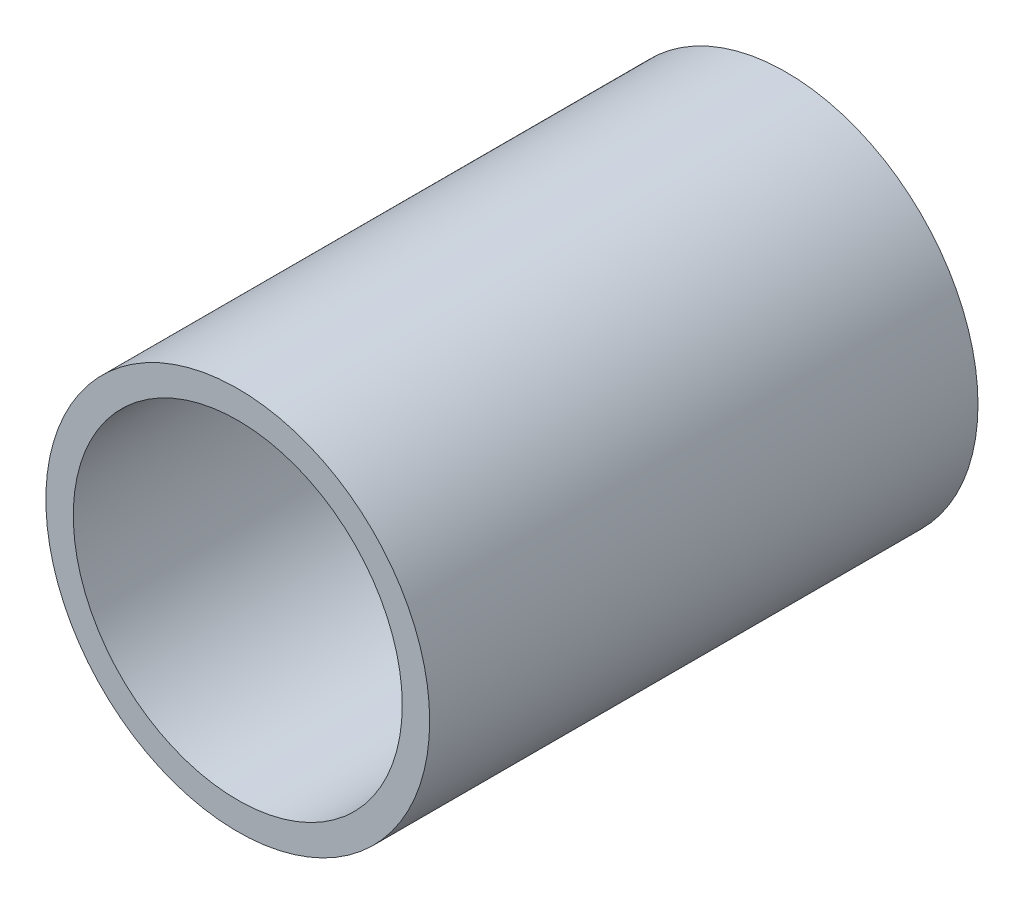
ISO-10303-21;
HEADER;
FILE_DESCRIPTION(('STEP AP214'),'2;1');
FILE_NAME('part.step','',(''),(''),'','','');
FILE_SCHEMA(('AUTOMOTIVE_DESIGN { 1 0 10303 214 1 1 1 1 }'));
ENDSEC;
DATA;
#1=APPLICATION_CONTEXT('core data for automotive mechanical design processes');
#2=APPLICATION_PROTOCOL_DEFINITION('international standard','automotive_design',2000,#1);
#3=PRODUCT_CONTEXT('',#1,'mechanical');
#4=PRODUCT('Part','Part','',(#3));
#5=PRODUCT_RELATED_PRODUCT_CATEGORY('part','',(#4));
#6=PRODUCT_DEFINITION_FORMATION('','',#4);
#7=PRODUCT_DEFINITION_CONTEXT('part definition',#1,'design');
#8=PRODUCT_DEFINITION('design','',#6,#7);
#9=PRODUCT_DEFINITION_SHAPE('','',#8);
#10=(LENGTH_UNIT() NAMED_UNIT(*) SI_UNIT(.MILLI.,.METRE.));
#11=(NAMED_UNIT(*) PLANE_ANGLE_UNIT() SI_UNIT($,.RADIAN.));
#12=(NAMED_UNIT(*) SI_UNIT($,.STERADIAN.) SOLID_ANGLE_UNIT());
#13=UNCERTAINTY_MEASURE_WITH_UNIT(LENGTH_MEASURE(1.E-05),#10,'distance_accuracy_value','');
#14=(GEOMETRIC_REPRESENTATION_CONTEXT(3) GLOBAL_UNCERTAINTY_ASSIGNED_CONTEXT((#13)) GLOBAL_UNIT_ASSIGNED_CONTEXT((#10,
#11,#12)) REPRESENTATION_CONTEXT('',''));
#15=CARTESIAN_POINT('',(0.,0.,0.));
#16=DIRECTION('',(0.,0.,1.));
#17=DIRECTION('',(1.,0.,0.));
#18=AXIS2_PLACEMENT_3D('',#15,#16,#17);
#19=CARTESIAN_POINT('',(0.,0.,25.4));
#20=DIRECTION('',(0.,0.,1.));
#21=DIRECTION('',(1.,0.,0.));
#22=AXIS2_PLACEMENT_3D('',#19,#20,#21);
#23=PLANE('',#22);
#24=CARTESIAN_POINT('',(0.,0.,25.4));
#25=DIRECTION('',(0.,0.,1.));
#26=DIRECTION('',(1.,0.,0.));
#27=AXIS2_PLACEMENT_3D('',#24,#25,#26);
#28=CIRCLE('',#27,8.89);
#29=CARTESIAN_POINT('',(8.89,0.,25.4));
#30=VERTEX_POINT('',#29);
#31=EDGE_CURVE('E10',#30,#30,#28,.T.);
#32=ORIENTED_EDGE('',*,*,#31,.T.);
#33=EDGE_LOOP('',(#32));
#34=FACE_BOUND('',#33,.T.);
#35=CARTESIAN_POINT('',(0.,0.,25.4));
#36=DIRECTION('',(0.,0.,1.));
#37=DIRECTION('',(1.,0.,0.));
#38=AXIS2_PLACEMENT_3D('',#35,#36,#37);
#39=CIRCLE('',#38,7.62);
#40=CARTESIAN_POINT('',(7.62,0.,25.4));
#41=VERTEX_POINT('',#40);
#42=EDGE_CURVE('E56',#41,#41,#39,.T.);
#43=ORIENTED_EDGE('',*,*,#42,.F.);
#44=EDGE_LOOP('',(#43));
#45=FACE_BOUND('',#44,.T.);
#46=ADVANCED_FACE('F43',(#34,#45),#23,.T.);
#47=CARTESIAN_POINT('',(0.,0.,0.));
#48=DIRECTION('',(0.,0.,1.));
#49=DIRECTION('',(1.,0.,0.));
#50=AXIS2_PLACEMENT_3D('',#47,#48,#49);
#51=PLANE('',#50);
#52=CARTESIAN_POINT('',(0.,0.,0.));
#53=DIRECTION('',(0.,0.,1.));
#54=DIRECTION('',(1.,0.,0.));
#55=AXIS2_PLACEMENT_3D('',#52,#53,#54);
#56=CIRCLE('',#55,8.89);
#57=CARTESIAN_POINT('',(8.89,0.,0.));
#58=VERTEX_POINT('',#57);
#59=EDGE_CURVE('E47',#58,#58,#56,.T.);
#60=ORIENTED_EDGE('',*,*,#59,.F.);
#61=EDGE_LOOP('',(#60));
#62=FACE_BOUND('',#61,.T.);
#63=CARTESIAN_POINT('',(0.,0.,0.));
#64=DIRECTION('',(0.,0.,1.));
#65=DIRECTION('',(1.,0.,0.));
#66=AXIS2_PLACEMENT_3D('',#63,#64,#65);
#67=CIRCLE('',#66,7.62);
#68=CARTESIAN_POINT('',(7.62,0.,0.));
#69=VERTEX_POINT('',#68);
#70=EDGE_CURVE('E58',#69,#69,#67,.T.);
#71=ORIENTED_EDGE('',*,*,#70,.T.);
#72=EDGE_LOOP('',(#71));
#73=FACE_BOUND('',#72,.T.);
#74=ADVANCED_FACE('F70',(#62,#73),#51,.F.);
#75=CARTESIAN_POINT('',(0.,0.,25.4));
#76=DIRECTION('',(0.,0.,-1.));
#77=DIRECTION('',(-1.,0.,0.));
#78=AXIS2_PLACEMENT_3D('',#75,#76,#77);
#79=CYLINDRICAL_SURFACE('',#78,8.89);
#80=ORIENTED_EDGE('',*,*,#31,.F.);
#81=EDGE_LOOP('',(#80));
#82=FACE_BOUND('',#81,.T.);
#83=ORIENTED_EDGE('',*,*,#59,.T.);
#84=EDGE_LOOP('',(#83));
#85=FACE_BOUND('',#84,.T.);
#86=ADVANCED_FACE('F45',(#82,#85),#79,.T.);
#87=CARTESIAN_POINT('',(0.,0.,25.4));
#88=DIRECTION('',(0.,0.,-1.));
#89=DIRECTION('',(-1.,0.,0.));
#90=AXIS2_PLACEMENT_3D('',#87,#88,#89);
#91=CYLINDRICAL_SURFACE('',#90,7.62);
#92=ORIENTED_EDGE('',*,*,#42,.T.);
#93=EDGE_LOOP('',(#92));
#94=FACE_BOUND('',#93,.T.);
#95=ORIENTED_EDGE('',*,*,#70,.F.);
#96=EDGE_LOOP('',(#95));
#97=FACE_BOUND('',#96,.T.);
#98=ADVANCED_FACE('F66',(#94,#97),#91,.F.);
#99=CLOSED_SHELL('',(#46,#74,#86,#98));
#100=MANIFOLD_SOLID_BREP('B2',#99);
#101=ADVANCED_BREP_SHAPE_REPRESENTATION('',(#18,#100),#14);
#102=SHAPE_DEFINITION_REPRESENTATION(#9,#101);
ENDSEC;
END-ISO-10303-21;
